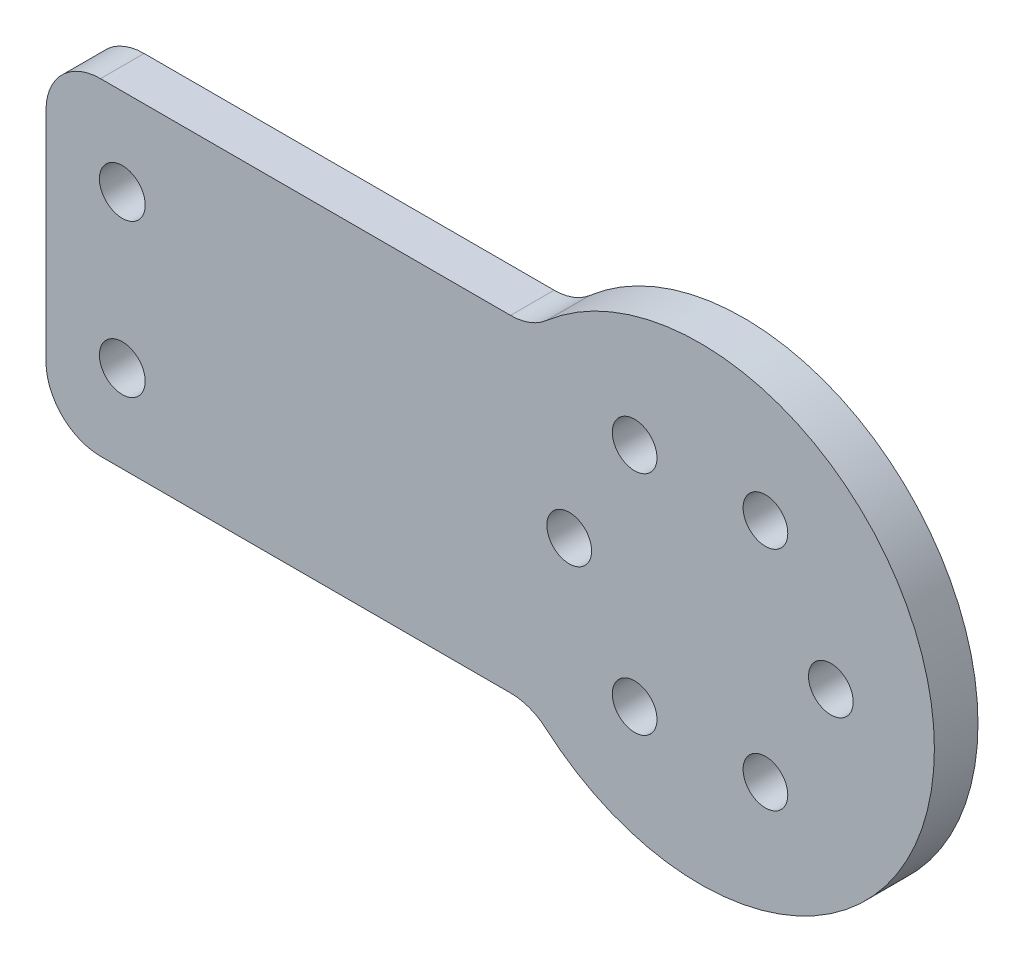
ISO-10303-21;
HEADER;
FILE_DESCRIPTION(('STEP AP214'),'2;1');
FILE_NAME('part.step','',(''),(''),'','','');
FILE_SCHEMA(('AUTOMOTIVE_DESIGN { 1 0 10303 214 1 1 1 1 }'));
ENDSEC;
DATA;
#1=APPLICATION_CONTEXT('core data for automotive mechanical design processes');
#2=APPLICATION_PROTOCOL_DEFINITION('international standard','automotive_design',2000,#1);
#3=PRODUCT_CONTEXT('',#1,'mechanical');
#4=PRODUCT('Part','Part','',(#3));
#5=PRODUCT_RELATED_PRODUCT_CATEGORY('part','',(#4));
#6=PRODUCT_DEFINITION_FORMATION('','',#4);
#7=PRODUCT_DEFINITION_CONTEXT('part definition',#1,'design');
#8=PRODUCT_DEFINITION('design','',#6,#7);
#9=PRODUCT_DEFINITION_SHAPE('','',#8);
#10=(LENGTH_UNIT() NAMED_UNIT(*) SI_UNIT(.MILLI.,.METRE.));
#11=(NAMED_UNIT(*) PLANE_ANGLE_UNIT() SI_UNIT($,.RADIAN.));
#12=(NAMED_UNIT(*) SI_UNIT($,.STERADIAN.) SOLID_ANGLE_UNIT());
#13=UNCERTAINTY_MEASURE_WITH_UNIT(LENGTH_MEASURE(1.E-05),#10,'distance_accuracy_value','');
#14=(GEOMETRIC_REPRESENTATION_CONTEXT(3) GLOBAL_UNCERTAINTY_ASSIGNED_CONTEXT((#13)) GLOBAL_UNIT_ASSIGNED_CONTEXT((#10,
#11,#12)) REPRESENTATION_CONTEXT('',''));
#15=CARTESIAN_POINT('',(0.,0.,0.));
#16=DIRECTION('',(0.,0.,1.));
#17=DIRECTION('',(1.,0.,0.));
#18=AXIS2_PLACEMENT_3D('',#15,#16,#17);
#19=CARTESIAN_POINT('',(0.,0.,-4.));
#20=DIRECTION('',(0.,0.,1.));
#21=DIRECTION('',(-1.,0.,0.));
#22=AXIS2_PLACEMENT_3D('',#19,#20,#21);
#23=PLANE('',#22);
#24=CARTESIAN_POINT('',(-53.,6.99999999999999,-4.));
#25=DIRECTION('',(0.,0.,1.));
#26=DIRECTION('',(1.,0.,0.));
#27=AXIS2_PLACEMENT_3D('',#24,#25,#26);
#28=CIRCLE('',#27,2.1);
#29=CARTESIAN_POINT('',(-50.9,6.99999999999999,-4.));
#30=VERTEX_POINT('',#29);
#31=EDGE_CURVE('E263',#30,#30,#28,.T.);
#32=ORIENTED_EDGE('',*,*,#31,.T.);
#33=EDGE_LOOP('',(#32));
#34=FACE_BOUND('',#33,.T.);
#35=CARTESIAN_POINT('',(-53.,-7.00000000000001,-4.));
#36=DIRECTION('',(0.,0.,1.));
#37=DIRECTION('',(1.,0.,0.));
#38=AXIS2_PLACEMENT_3D('',#35,#36,#37);
#39=CIRCLE('',#38,2.1);
#40=CARTESIAN_POINT('',(-50.9,-7.00000000000001,-4.));
#41=VERTEX_POINT('',#40);
#42=EDGE_CURVE('E259',#41,#41,#39,.T.);
#43=ORIENTED_EDGE('',*,*,#42,.T.);
#44=EDGE_LOOP('',(#43));
#45=FACE_BOUND('',#44,.T.);
#46=DIRECTION('',(0.,-1.,0.));
#47=VECTOR('',#46,1.);
#48=CARTESIAN_POINT('',(-60.,0.,-4.));
#49=LINE('',#48,#47);
#50=CARTESIAN_POINT('',(-60.,9.99999999999999,-4.));
#51=VERTEX_POINT('',#50);
#52=CARTESIAN_POINT('',(-60.,-10.,-4.));
#53=VERTEX_POINT('',#52);
#54=EDGE_CURVE('E207',#51,#53,#49,.T.);
#55=ORIENTED_EDGE('',*,*,#54,.F.);
#56=CARTESIAN_POINT('',(-55.,9.99999999999999,-4.));
#57=DIRECTION('',(0.,0.,-1.));
#58=DIRECTION('',(-1.,0.,0.));
#59=AXIS2_PLACEMENT_3D('',#56,#57,#58);
#60=CIRCLE('',#59,5.);
#61=CARTESIAN_POINT('',(-55.,15.,-4.));
#62=VERTEX_POINT('',#61);
#63=EDGE_CURVE('E166',#62,#51,#60,.F.);
#64=ORIENTED_EDGE('',*,*,#63,.F.);
#65=DIRECTION('',(-1.,0.,0.));
#66=VECTOR('',#65,1.);
#67=CARTESIAN_POINT('',(-60.,15.,-4.));
#68=LINE('',#67,#66);
#69=CARTESIAN_POINT('',(-17.3853386507137,15.,-4.));
#70=VERTEX_POINT('',#69);
#71=EDGE_CURVE('E149',#70,#62,#68,.T.);
#72=ORIENTED_EDGE('',*,*,#71,.F.);
#73=CARTESIAN_POINT('',(-17.3853386507137,20.,-4.));
#74=DIRECTION('',(0.,0.,-1.));
#75=DIRECTION('',(-1.,0.,0.));
#76=AXIS2_PLACEMENT_3D('',#73,#74,#75);
#77=CIRCLE('',#76,5.);
#78=CARTESIAN_POINT('',(-14.1050860751074,16.2264150943396,-4.));
#79=VERTEX_POINT('',#78);
#80=EDGE_CURVE('E11',#79,#70,#77,.T.);
#81=ORIENTED_EDGE('',*,*,#80,.F.);
#82=CARTESIAN_POINT('',(0.,0.,-4.));
#83=DIRECTION('',(0.,0.,1.));
#84=DIRECTION('',(-1.,0.,0.));
#85=AXIS2_PLACEMENT_3D('',#82,#83,#84);
#86=CIRCLE('',#85,21.5);
#87=CARTESIAN_POINT('',(-14.1050860751073,-16.2264150943396,-4.));
#88=VERTEX_POINT('',#87);
#89=EDGE_CURVE('E143',#88,#79,#86,.T.);
#90=ORIENTED_EDGE('',*,*,#89,.F.);
#91=CARTESIAN_POINT('',(-17.3853386507137,-20.,-4.));
#92=DIRECTION('',(0.,0.,-1.));
#93=DIRECTION('',(-1.,0.,0.));
#94=AXIS2_PLACEMENT_3D('',#91,#92,#93);
#95=CIRCLE('',#94,5.);
#96=CARTESIAN_POINT('',(-17.3853386507137,-15.,-4.));
#97=VERTEX_POINT('',#96);
#98=EDGE_CURVE('E184',#97,#88,#95,.T.);
#99=ORIENTED_EDGE('',*,*,#98,.F.);
#100=DIRECTION('',(1.,0.,0.));
#101=VECTOR('',#100,1.);
#102=CARTESIAN_POINT('',(-60.,-15.,-4.));
#103=LINE('',#102,#101);
#104=CARTESIAN_POINT('',(-55.,-15.,-4.));
#105=VERTEX_POINT('',#104);
#106=EDGE_CURVE('E157',#105,#97,#103,.T.);
#107=ORIENTED_EDGE('',*,*,#106,.F.);
#108=CARTESIAN_POINT('',(-55.,-10.,-4.));
#109=DIRECTION('',(0.,0.,-1.));
#110=DIRECTION('',(-1.,0.,0.));
#111=AXIS2_PLACEMENT_3D('',#108,#109,#110);
#112=CIRCLE('',#111,5.);
#113=EDGE_CURVE('E119',#53,#105,#112,.F.);
#114=ORIENTED_EDGE('',*,*,#113,.F.);
#115=EDGE_LOOP('',(#55,#64,#72,#81,#90,#99,#107,#114));
#116=FACE_BOUND('',#115,.T.);
#117=CARTESIAN_POINT('',(12.,0.,-4.));
#118=DIRECTION('',(0.,0.,1.));
#119=DIRECTION('',(1.,0.,0.));
#120=AXIS2_PLACEMENT_3D('',#117,#118,#119);
#121=CIRCLE('',#120,2.05);
#122=CARTESIAN_POINT('',(14.05,0.,-4.));
#123=VERTEX_POINT('',#122);
#124=EDGE_CURVE('E198',#123,#123,#121,.T.);
#125=ORIENTED_EDGE('',*,*,#124,.T.);
#126=EDGE_LOOP('',(#125));
#127=FACE_BOUND('',#126,.T.);
#128=CARTESIAN_POINT('',(5.99999999999998,-10.3923048454133,-4.));
#129=DIRECTION('',(0.,0.,1.));
#130=DIRECTION('',(1.,0.,0.));
#131=AXIS2_PLACEMENT_3D('',#128,#129,#130);
#132=CIRCLE('',#131,2.05);
#133=CARTESIAN_POINT('',(8.04999999999998,-10.3923048454133,-4.));
#134=VERTEX_POINT('',#133);
#135=EDGE_CURVE('E214',#134,#134,#132,.T.);
#136=ORIENTED_EDGE('',*,*,#135,.T.);
#137=EDGE_LOOP('',(#136));
#138=FACE_BOUND('',#137,.T.);
#139=CARTESIAN_POINT('',(-6.00000000000005,-10.3923048454132,-4.));
#140=DIRECTION('',(0.,0.,1.));
#141=DIRECTION('',(1.,0.,0.));
#142=AXIS2_PLACEMENT_3D('',#139,#140,#141);
#143=CIRCLE('',#142,2.05);
#144=CARTESIAN_POINT('',(-3.95000000000005,-10.3923048454132,-4.));
#145=VERTEX_POINT('',#144);
#146=EDGE_CURVE('E220',#145,#145,#143,.T.);
#147=ORIENTED_EDGE('',*,*,#146,.T.);
#148=EDGE_LOOP('',(#147));
#149=FACE_BOUND('',#148,.T.);
#150=CARTESIAN_POINT('',(-12.,0.,-4.));
#151=DIRECTION('',(0.,0.,1.));
#152=DIRECTION('',(1.,0.,0.));
#153=AXIS2_PLACEMENT_3D('',#150,#151,#152);
#154=CIRCLE('',#153,2.05);
#155=CARTESIAN_POINT('',(-9.95,0.,-4.));
#156=VERTEX_POINT('',#155);
#157=EDGE_CURVE('E228',#156,#156,#154,.T.);
#158=ORIENTED_EDGE('',*,*,#157,.T.);
#159=EDGE_LOOP('',(#158));
#160=FACE_BOUND('',#159,.T.);
#161=CARTESIAN_POINT('',(-5.9999999999999,10.3923048454133,-4.));
#162=DIRECTION('',(0.,0.,1.));
#163=DIRECTION('',(1.,0.,0.));
#164=AXIS2_PLACEMENT_3D('',#161,#162,#163);
#165=CIRCLE('',#164,2.05);
#166=CARTESIAN_POINT('',(-3.94999999999991,10.3923048454133,-4.));
#167=VERTEX_POINT('',#166);
#168=EDGE_CURVE('E235',#167,#167,#165,.T.);
#169=ORIENTED_EDGE('',*,*,#168,.T.);
#170=EDGE_LOOP('',(#169));
#171=FACE_BOUND('',#170,.T.);
#172=CARTESIAN_POINT('',(6.00000000000012,10.3923048454132,-4.));
#173=DIRECTION('',(0.,0.,1.));
#174=DIRECTION('',(1.,0.,0.));
#175=AXIS2_PLACEMENT_3D('',#172,#173,#174);
#176=CIRCLE('',#175,2.05);
#177=CARTESIAN_POINT('',(8.05000000000012,10.3923048454132,-4.));
#178=VERTEX_POINT('',#177);
#179=EDGE_CURVE('E243',#178,#178,#176,.T.);
#180=ORIENTED_EDGE('',*,*,#179,.T.);
#181=EDGE_LOOP('',(#180));
#182=FACE_BOUND('',#181,.T.);
#183=ADVANCED_FACE('F47',(#34,#45,#116,#127,#138,#149,#160,#171,#182),#23,.F.);
#184=CARTESIAN_POINT('',(0.,0.,0.));
#185=DIRECTION('',(0.,0.,1.));
#186=DIRECTION('',(-1.,0.,0.));
#187=AXIS2_PLACEMENT_3D('',#184,#185,#186);
#188=PLANE('',#187);
#189=CARTESIAN_POINT('',(-53.,6.99999999999999,0.));
#190=DIRECTION('',(0.,0.,1.));
#191=DIRECTION('',(1.,0.,0.));
#192=AXIS2_PLACEMENT_3D('',#189,#190,#191);
#193=CIRCLE('',#192,2.1);
#194=CARTESIAN_POINT('',(-50.9,6.99999999999999,0.));
#195=VERTEX_POINT('',#194);
#196=EDGE_CURVE('E251',#195,#195,#193,.T.);
#197=ORIENTED_EDGE('',*,*,#196,.F.);
#198=EDGE_LOOP('',(#197));
#199=FACE_BOUND('',#198,.T.);
#200=CARTESIAN_POINT('',(-53.,-7.00000000000001,0.));
#201=DIRECTION('',(0.,0.,1.));
#202=DIRECTION('',(1.,0.,0.));
#203=AXIS2_PLACEMENT_3D('',#200,#201,#202);
#204=CIRCLE('',#203,2.1);
#205=CARTESIAN_POINT('',(-50.9,-7.00000000000001,0.));
#206=VERTEX_POINT('',#205);
#207=EDGE_CURVE('E255',#206,#206,#204,.T.);
#208=ORIENTED_EDGE('',*,*,#207,.F.);
#209=EDGE_LOOP('',(#208));
#210=FACE_BOUND('',#209,.T.);
#211=CARTESIAN_POINT('',(-5.9999999999999,10.3923048454133,0.));
#212=DIRECTION('',(0.,0.,1.));
#213=DIRECTION('',(1.,0.,0.));
#214=AXIS2_PLACEMENT_3D('',#211,#212,#213);
#215=CIRCLE('',#214,2.05);
#216=CARTESIAN_POINT('',(-3.94999999999991,10.3923048454133,0.));
#217=VERTEX_POINT('',#216);
#218=EDGE_CURVE('E239',#217,#217,#215,.T.);
#219=ORIENTED_EDGE('',*,*,#218,.F.);
#220=EDGE_LOOP('',(#219));
#221=FACE_BOUND('',#220,.T.);
#222=CARTESIAN_POINT('',(-6.00000000000005,-10.3923048454132,0.));
#223=DIRECTION('',(0.,0.,1.));
#224=DIRECTION('',(1.,0.,0.));
#225=AXIS2_PLACEMENT_3D('',#222,#223,#224);
#226=CIRCLE('',#225,2.05);
#227=CARTESIAN_POINT('',(-3.95000000000005,-10.3923048454132,0.));
#228=VERTEX_POINT('',#227);
#229=EDGE_CURVE('E224',#228,#228,#226,.T.);
#230=ORIENTED_EDGE('',*,*,#229,.F.);
#231=EDGE_LOOP('',(#230));
#232=FACE_BOUND('',#231,.T.);
#233=CARTESIAN_POINT('',(12.,0.,0.));
#234=DIRECTION('',(0.,0.,1.));
#235=DIRECTION('',(1.,0.,0.));
#236=AXIS2_PLACEMENT_3D('',#233,#234,#235);
#237=CIRCLE('',#236,2.05);
#238=CARTESIAN_POINT('',(14.05,0.,0.));
#239=VERTEX_POINT('',#238);
#240=EDGE_CURVE('E203',#239,#239,#237,.T.);
#241=ORIENTED_EDGE('',*,*,#240,.F.);
#242=EDGE_LOOP('',(#241));
#243=FACE_BOUND('',#242,.T.);
#244=DIRECTION('',(1.,0.,0.));
#245=VECTOR('',#244,1.);
#246=CARTESIAN_POINT('',(-60.,-15.,0.));
#247=LINE('',#246,#245);
#248=CARTESIAN_POINT('',(-55.,-15.,0.));
#249=VERTEX_POINT('',#248);
#250=CARTESIAN_POINT('',(-17.3853386507137,-15.,0.));
#251=VERTEX_POINT('',#250);
#252=EDGE_CURVE('E133',#249,#251,#247,.T.);
#253=ORIENTED_EDGE('',*,*,#252,.T.);
#254=CARTESIAN_POINT('',(-17.3853386507137,-20.,0.));
#255=DIRECTION('',(0.,0.,-1.));
#256=DIRECTION('',(-1.,0.,0.));
#257=AXIS2_PLACEMENT_3D('',#254,#255,#256);
#258=CIRCLE('',#257,5.);
#259=CARTESIAN_POINT('',(-14.1050860751073,-16.2264150943396,0.));
#260=VERTEX_POINT('',#259);
#261=EDGE_CURVE('E181',#260,#251,#258,.F.);
#262=ORIENTED_EDGE('',*,*,#261,.F.);
#263=CARTESIAN_POINT('',(0.,0.,0.));
#264=DIRECTION('',(0.,0.,1.));
#265=DIRECTION('',(-1.,0.,0.));
#266=AXIS2_PLACEMENT_3D('',#263,#264,#265);
#267=CIRCLE('',#266,21.5);
#268=CARTESIAN_POINT('',(-14.1050860751074,16.2264150943396,0.));
#269=VERTEX_POINT('',#268);
#270=EDGE_CURVE('E195',#260,#269,#267,.T.);
#271=ORIENTED_EDGE('',*,*,#270,.T.);
#272=CARTESIAN_POINT('',(-17.3853386507137,20.,0.));
#273=DIRECTION('',(0.,0.,-1.));
#274=DIRECTION('',(-1.,0.,0.));
#275=AXIS2_PLACEMENT_3D('',#272,#273,#274);
#276=CIRCLE('',#275,5.);
#277=CARTESIAN_POINT('',(-17.3853386507137,15.,0.));
#278=VERTEX_POINT('',#277);
#279=EDGE_CURVE('E56',#278,#269,#276,.F.);
#280=ORIENTED_EDGE('',*,*,#279,.F.);
#281=DIRECTION('',(-1.,0.,0.));
#282=VECTOR('',#281,1.);
#283=CARTESIAN_POINT('',(-60.,15.,0.));
#284=LINE('',#283,#282);
#285=CARTESIAN_POINT('',(-55.,15.,0.));
#286=VERTEX_POINT('',#285);
#287=EDGE_CURVE('E152',#278,#286,#284,.T.);
#288=ORIENTED_EDGE('',*,*,#287,.T.);
#289=CARTESIAN_POINT('',(-55.,9.99999999999999,0.));
#290=DIRECTION('',(0.,0.,-1.));
#291=DIRECTION('',(-1.,0.,0.));
#292=AXIS2_PLACEMENT_3D('',#289,#290,#291);
#293=CIRCLE('',#292,5.);
#294=CARTESIAN_POINT('',(-60.,9.99999999999999,0.));
#295=VERTEX_POINT('',#294);
#296=EDGE_CURVE('E125',#295,#286,#293,.T.);
#297=ORIENTED_EDGE('',*,*,#296,.F.);
#298=DIRECTION('',(0.,-1.,0.));
#299=VECTOR('',#298,1.);
#300=CARTESIAN_POINT('',(-60.,0.,0.));
#301=LINE('',#300,#299);
#302=CARTESIAN_POINT('',(-60.,-10.,0.));
#303=VERTEX_POINT('',#302);
#304=EDGE_CURVE('E136',#295,#303,#301,.T.);
#305=ORIENTED_EDGE('',*,*,#304,.T.);
#306=CARTESIAN_POINT('',(-55.,-10.,0.));
#307=DIRECTION('',(0.,0.,-1.));
#308=DIRECTION('',(-1.,0.,0.));
#309=AXIS2_PLACEMENT_3D('',#306,#307,#308);
#310=CIRCLE('',#309,5.);
#311=EDGE_CURVE('E116',#249,#303,#310,.T.);
#312=ORIENTED_EDGE('',*,*,#311,.F.);
#313=EDGE_LOOP('',(#253,#262,#271,#280,#288,#297,#305,#312));
#314=FACE_BOUND('',#313,.T.);
#315=CARTESIAN_POINT('',(5.99999999999998,-10.3923048454133,0.));
#316=DIRECTION('',(0.,0.,1.));
#317=DIRECTION('',(1.,0.,0.));
#318=AXIS2_PLACEMENT_3D('',#315,#316,#317);
#319=CIRCLE('',#318,2.05);
#320=CARTESIAN_POINT('',(8.04999999999998,-10.3923048454133,0.));
#321=VERTEX_POINT('',#320);
#322=EDGE_CURVE('E216',#321,#321,#319,.T.);
#323=ORIENTED_EDGE('',*,*,#322,.F.);
#324=EDGE_LOOP('',(#323));
#325=FACE_BOUND('',#324,.T.);
#326=CARTESIAN_POINT('',(-12.,0.,0.));
#327=DIRECTION('',(0.,0.,1.));
#328=DIRECTION('',(1.,0.,0.));
#329=AXIS2_PLACEMENT_3D('',#326,#327,#328);
#330=CIRCLE('',#329,2.05);
#331=CARTESIAN_POINT('',(-9.95,0.,0.));
#332=VERTEX_POINT('',#331);
#333=EDGE_CURVE('E232',#332,#332,#330,.T.);
#334=ORIENTED_EDGE('',*,*,#333,.F.);
#335=EDGE_LOOP('',(#334));
#336=FACE_BOUND('',#335,.T.);
#337=CARTESIAN_POINT('',(6.00000000000012,10.3923048454132,0.));
#338=DIRECTION('',(0.,0.,1.));
#339=DIRECTION('',(1.,0.,0.));
#340=AXIS2_PLACEMENT_3D('',#337,#338,#339);
#341=CIRCLE('',#340,2.05);
#342=CARTESIAN_POINT('',(8.05000000000012,10.3923048454132,0.));
#343=VERTEX_POINT('',#342);
#344=EDGE_CURVE('E247',#343,#343,#341,.T.);
#345=ORIENTED_EDGE('',*,*,#344,.F.);
#346=EDGE_LOOP('',(#345));
#347=FACE_BOUND('',#346,.T.);
#348=ADVANCED_FACE('F130',(#199,#210,#221,#232,#243,#314,#325,#336,#347),#188,.T.);
#349=CARTESIAN_POINT('',(0.,0.,-4.));
#350=DIRECTION('',(0.,0.,1.));
#351=DIRECTION('',(-1.,0.,0.));
#352=AXIS2_PLACEMENT_3D('',#349,#350,#351);
#353=CYLINDRICAL_SURFACE('',#352,21.5);
#354=ORIENTED_EDGE('',*,*,#89,.T.);
#355=DIRECTION('',(0.,0.,1.));
#356=VECTOR('',#355,1.);
#357=CARTESIAN_POINT('',(-14.1050860751074,16.2264150943396,-4.));
#358=LINE('',#357,#356);
#359=EDGE_CURVE('E175',#269,#79,#358,.F.);
#360=ORIENTED_EDGE('',*,*,#359,.F.);
#361=ORIENTED_EDGE('',*,*,#270,.F.);
#362=DIRECTION('',(0.,0.,1.));
#363=VECTOR('',#362,1.);
#364=CARTESIAN_POINT('',(-14.1050860751073,-16.2264150943396,-4.));
#365=LINE('',#364,#363);
#366=EDGE_CURVE('E178',#88,#260,#365,.T.);
#367=ORIENTED_EDGE('',*,*,#366,.F.);
#368=EDGE_LOOP('',(#354,#360,#361,#367));
#369=FACE_BOUND('',#368,.T.);
#370=ADVANCED_FACE('F276',(#369),#353,.T.);
#371=CARTESIAN_POINT('',(-60.,15.,-4.));
#372=DIRECTION('',(0.,-1.,0.));
#373=DIRECTION('',(1.,0.,0.));
#374=AXIS2_PLACEMENT_3D('',#371,#372,#373);
#375=PLANE('',#374);
#376=ORIENTED_EDGE('',*,*,#287,.F.);
#377=DIRECTION('',(0.,0.,-1.));
#378=VECTOR('',#377,1.);
#379=CARTESIAN_POINT('',(-17.3853386507137,15.,0.));
#380=LINE('',#379,#378);
#381=EDGE_CURVE('E70',#70,#278,#380,.F.);
#382=ORIENTED_EDGE('',*,*,#381,.F.);
#383=ORIENTED_EDGE('',*,*,#71,.T.);
#384=DIRECTION('',(0.,0.,1.));
#385=VECTOR('',#384,1.);
#386=CARTESIAN_POINT('',(-55.,15.,-4.));
#387=LINE('',#386,#385);
#388=EDGE_CURVE('E63',#286,#62,#387,.F.);
#389=ORIENTED_EDGE('',*,*,#388,.F.);
#390=EDGE_LOOP('',(#376,#382,#383,#389));
#391=FACE_BOUND('',#390,.T.);
#392=ADVANCED_FACE('F310',(#391),#375,.F.);
#393=CARTESIAN_POINT('',(-60.,0.,-4.));
#394=DIRECTION('',(1.,0.,0.));
#395=DIRECTION('',(0.,0.,1.));
#396=AXIS2_PLACEMENT_3D('',#393,#394,#395);
#397=PLANE('',#396);
#398=ORIENTED_EDGE('',*,*,#304,.F.);
#399=DIRECTION('',(0.,0.,1.));
#400=VECTOR('',#399,1.);
#401=CARTESIAN_POINT('',(-60.,9.99999999999999,-4.));
#402=LINE('',#401,#400);
#403=EDGE_CURVE('E138',#51,#295,#402,.T.);
#404=ORIENTED_EDGE('',*,*,#403,.F.);
#405=ORIENTED_EDGE('',*,*,#54,.T.);
#406=DIRECTION('',(0.,0.,1.));
#407=VECTOR('',#406,1.);
#408=CARTESIAN_POINT('',(-60.,-10.,-4.));
#409=LINE('',#408,#407);
#410=EDGE_CURVE('E163',#303,#53,#409,.F.);
#411=ORIENTED_EDGE('',*,*,#410,.F.);
#412=EDGE_LOOP('',(#398,#404,#405,#411));
#413=FACE_BOUND('',#412,.T.);
#414=ADVANCED_FACE('F298',(#413),#397,.F.);
#415=CARTESIAN_POINT('',(-60.,-15.,-4.));
#416=DIRECTION('',(0.,1.,0.));
#417=DIRECTION('',(-1.,0.,0.));
#418=AXIS2_PLACEMENT_3D('',#415,#416,#417);
#419=PLANE('',#418);
#420=ORIENTED_EDGE('',*,*,#106,.T.);
#421=DIRECTION('',(0.,0.,-1.));
#422=VECTOR('',#421,1.);
#423=CARTESIAN_POINT('',(-17.3853386507137,-15.,-4.));
#424=LINE('',#423,#422);
#425=EDGE_CURVE('E126',#251,#97,#424,.T.);
#426=ORIENTED_EDGE('',*,*,#425,.F.);
#427=ORIENTED_EDGE('',*,*,#252,.F.);
#428=DIRECTION('',(0.,0.,1.));
#429=VECTOR('',#428,1.);
#430=CARTESIAN_POINT('',(-55.,-15.,-4.));
#431=LINE('',#430,#429);
#432=EDGE_CURVE('E113',#105,#249,#431,.T.);
#433=ORIENTED_EDGE('',*,*,#432,.F.);
#434=EDGE_LOOP('',(#420,#426,#427,#433));
#435=FACE_BOUND('',#434,.T.);
#436=ADVANCED_FACE('F140',(#435),#419,.F.);
#437=CARTESIAN_POINT('',(12.,0.,-4.));
#438=DIRECTION('',(0.,0.,1.));
#439=DIRECTION('',(-1.,0.,0.));
#440=AXIS2_PLACEMENT_3D('',#437,#438,#439);
#441=CYLINDRICAL_SURFACE('',#440,2.05);
#442=ORIENTED_EDGE('',*,*,#124,.F.);
#443=EDGE_LOOP('',(#442));
#444=FACE_BOUND('',#443,.T.);
#445=ORIENTED_EDGE('',*,*,#240,.T.);
#446=EDGE_LOOP('',(#445));
#447=FACE_BOUND('',#446,.T.);
#448=ADVANCED_FACE('F286',(#444,#447),#441,.F.);
#449=CARTESIAN_POINT('',(5.99999999999998,-10.3923048454133,-4.));
#450=DIRECTION('',(0.,0.,1.));
#451=DIRECTION('',(-1.,0.,0.));
#452=AXIS2_PLACEMENT_3D('',#449,#450,#451);
#453=CYLINDRICAL_SURFACE('',#452,2.05);
#454=ORIENTED_EDGE('',*,*,#135,.F.);
#455=EDGE_LOOP('',(#454));
#456=FACE_BOUND('',#455,.T.);
#457=ORIENTED_EDGE('',*,*,#322,.T.);
#458=EDGE_LOOP('',(#457));
#459=FACE_BOUND('',#458,.T.);
#460=ADVANCED_FACE('F288',(#456,#459),#453,.F.);
#461=CARTESIAN_POINT('',(-6.00000000000005,-10.3923048454132,-4.));
#462=DIRECTION('',(0.,0.,1.));
#463=DIRECTION('',(-1.,0.,0.));
#464=AXIS2_PLACEMENT_3D('',#461,#462,#463);
#465=CYLINDRICAL_SURFACE('',#464,2.05);
#466=ORIENTED_EDGE('',*,*,#146,.F.);
#467=EDGE_LOOP('',(#466));
#468=FACE_BOUND('',#467,.T.);
#469=ORIENTED_EDGE('',*,*,#229,.T.);
#470=EDGE_LOOP('',(#469));
#471=FACE_BOUND('',#470,.T.);
#472=ADVANCED_FACE('F295',(#468,#471),#465,.F.);
#473=CARTESIAN_POINT('',(-12.,0.,-4.));
#474=DIRECTION('',(0.,0.,1.));
#475=DIRECTION('',(-1.,0.,0.));
#476=AXIS2_PLACEMENT_3D('',#473,#474,#475);
#477=CYLINDRICAL_SURFACE('',#476,2.05);
#478=ORIENTED_EDGE('',*,*,#157,.F.);
#479=EDGE_LOOP('',(#478));
#480=FACE_BOUND('',#479,.T.);
#481=ORIENTED_EDGE('',*,*,#333,.T.);
#482=EDGE_LOOP('',(#481));
#483=FACE_BOUND('',#482,.T.);
#484=ADVANCED_FACE('F359',(#480,#483),#477,.F.);
#485=CARTESIAN_POINT('',(-5.9999999999999,10.3923048454133,-4.));
#486=DIRECTION('',(0.,0.,1.));
#487=DIRECTION('',(-1.,0.,0.));
#488=AXIS2_PLACEMENT_3D('',#485,#486,#487);
#489=CYLINDRICAL_SURFACE('',#488,2.05);
#490=ORIENTED_EDGE('',*,*,#168,.F.);
#491=EDGE_LOOP('',(#490));
#492=FACE_BOUND('',#491,.T.);
#493=ORIENTED_EDGE('',*,*,#218,.T.);
#494=EDGE_LOOP('',(#493));
#495=FACE_BOUND('',#494,.T.);
#496=ADVANCED_FACE('F349',(#492,#495),#489,.F.);
#497=CARTESIAN_POINT('',(6.00000000000012,10.3923048454132,-4.));
#498=DIRECTION('',(0.,0.,1.));
#499=DIRECTION('',(-1.,0.,0.));
#500=AXIS2_PLACEMENT_3D('',#497,#498,#499);
#501=CYLINDRICAL_SURFACE('',#500,2.05);
#502=ORIENTED_EDGE('',*,*,#179,.F.);
#503=EDGE_LOOP('',(#502));
#504=FACE_BOUND('',#503,.T.);
#505=ORIENTED_EDGE('',*,*,#344,.T.);
#506=EDGE_LOOP('',(#505));
#507=FACE_BOUND('',#506,.T.);
#508=ADVANCED_FACE('F345',(#504,#507),#501,.F.);
#509=CARTESIAN_POINT('',(-53.,-7.00000000000001,0.));
#510=DIRECTION('',(0.,0.,-1.));
#511=DIRECTION('',(1.,0.,0.));
#512=AXIS2_PLACEMENT_3D('',#509,#510,#511);
#513=CYLINDRICAL_SURFACE('',#512,2.1);
#514=ORIENTED_EDGE('',*,*,#207,.T.);
#515=EDGE_LOOP('',(#514));
#516=FACE_BOUND('',#515,.T.);
#517=ORIENTED_EDGE('',*,*,#42,.F.);
#518=EDGE_LOOP('',(#517));
#519=FACE_BOUND('',#518,.T.);
#520=ADVANCED_FACE('F348',(#516,#519),#513,.F.);
#521=CARTESIAN_POINT('',(-53.,6.99999999999999,0.));
#522=DIRECTION('',(0.,0.,-1.));
#523=DIRECTION('',(1.,0.,0.));
#524=AXIS2_PLACEMENT_3D('',#521,#522,#523);
#525=CYLINDRICAL_SURFACE('',#524,2.1);
#526=ORIENTED_EDGE('',*,*,#196,.T.);
#527=EDGE_LOOP('',(#526));
#528=FACE_BOUND('',#527,.T.);
#529=ORIENTED_EDGE('',*,*,#31,.F.);
#530=EDGE_LOOP('',(#529));
#531=FACE_BOUND('',#530,.T.);
#532=ADVANCED_FACE('F271',(#528,#531),#525,.F.);
#533=CARTESIAN_POINT('',(-55.,-10.,-4.));
#534=DIRECTION('',(0.,0.,1.));
#535=DIRECTION('',(-1.,0.,0.));
#536=AXIS2_PLACEMENT_3D('',#533,#534,#535);
#537=CYLINDRICAL_SURFACE('',#536,5.);
#538=ORIENTED_EDGE('',*,*,#113,.T.);
#539=ORIENTED_EDGE('',*,*,#432,.T.);
#540=ORIENTED_EDGE('',*,*,#311,.T.);
#541=ORIENTED_EDGE('',*,*,#410,.T.);
#542=EDGE_LOOP('',(#538,#539,#540,#541));
#543=FACE_BOUND('',#542,.T.);
#544=ADVANCED_FACE('F115',(#543),#537,.T.);
#545=CARTESIAN_POINT('',(-55.,9.99999999999999,-4.));
#546=DIRECTION('',(0.,0.,1.));
#547=DIRECTION('',(-1.,0.,0.));
#548=AXIS2_PLACEMENT_3D('',#545,#546,#547);
#549=CYLINDRICAL_SURFACE('',#548,5.);
#550=ORIENTED_EDGE('',*,*,#63,.T.);
#551=ORIENTED_EDGE('',*,*,#403,.T.);
#552=ORIENTED_EDGE('',*,*,#296,.T.);
#553=ORIENTED_EDGE('',*,*,#388,.T.);
#554=EDGE_LOOP('',(#550,#551,#552,#553));
#555=FACE_BOUND('',#554,.T.);
#556=ADVANCED_FACE('F318',(#555),#549,.T.);
#557=CARTESIAN_POINT('',(-17.3853386507137,-20.,-4.));
#558=DIRECTION('',(0.,0.,1.));
#559=DIRECTION('',(-1.,0.,0.));
#560=AXIS2_PLACEMENT_3D('',#557,#558,#559);
#561=CYLINDRICAL_SURFACE('',#560,5.);
#562=ORIENTED_EDGE('',*,*,#98,.T.);
#563=ORIENTED_EDGE('',*,*,#366,.T.);
#564=ORIENTED_EDGE('',*,*,#261,.T.);
#565=ORIENTED_EDGE('',*,*,#425,.T.);
#566=EDGE_LOOP('',(#562,#563,#564,#565));
#567=FACE_BOUND('',#566,.T.);
#568=ADVANCED_FACE('F320',(#567),#561,.F.);
#569=CARTESIAN_POINT('',(-17.3853386507137,20.,-4.));
#570=DIRECTION('',(0.,0.,1.));
#571=DIRECTION('',(-1.,0.,0.));
#572=AXIS2_PLACEMENT_3D('',#569,#570,#571);
#573=CYLINDRICAL_SURFACE('',#572,5.);
#574=ORIENTED_EDGE('',*,*,#80,.T.);
#575=ORIENTED_EDGE('',*,*,#381,.T.);
#576=ORIENTED_EDGE('',*,*,#279,.T.);
#577=ORIENTED_EDGE('',*,*,#359,.T.);
#578=EDGE_LOOP('',(#574,#575,#576,#577));
#579=FACE_BOUND('',#578,.T.);
#580=ADVANCED_FACE('F49',(#579),#573,.F.);
#581=CLOSED_SHELL('',(#183,#348,#370,#392,#414,#436,#448,#460,#472,#484,#496,#508,#520,#532,
#544,#556,#568,#580));
#582=MANIFOLD_SOLID_BREP('B2',#581);
#583=ADVANCED_BREP_SHAPE_REPRESENTATION('',(#18,#582),#14);
#584=SHAPE_DEFINITION_REPRESENTATION(#9,#583);
ENDSEC;
END-ISO-10303-21;
